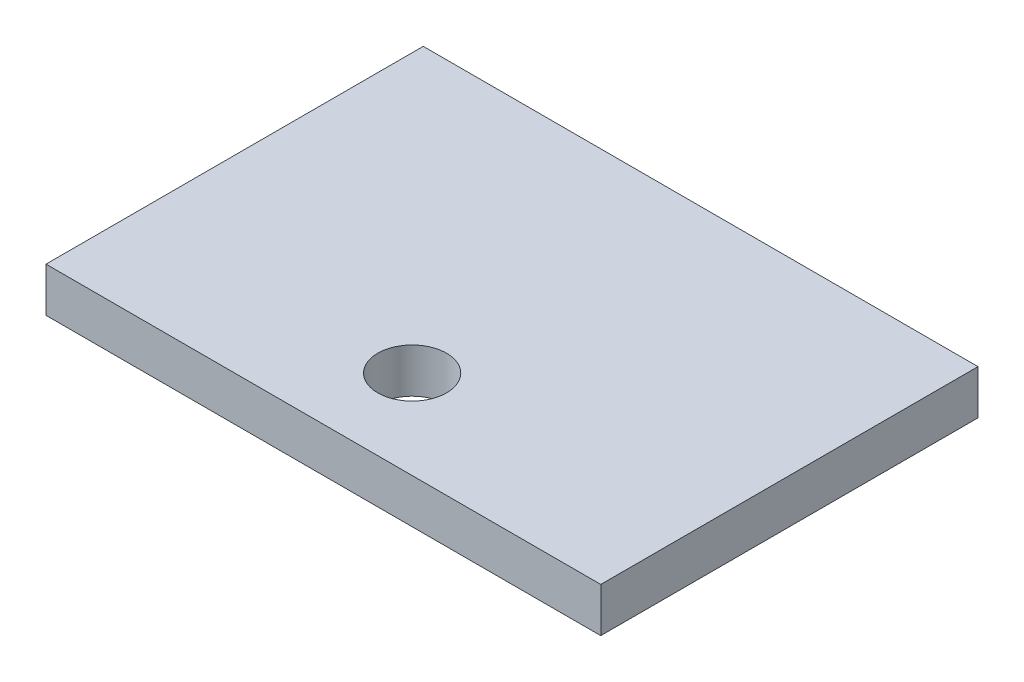
ISO-10303-21;
HEADER;
FILE_DESCRIPTION(('STEP AP214'),'2;1');
FILE_NAME('part.step','',(''),(''),'','','');
FILE_SCHEMA(('AUTOMOTIVE_DESIGN { 1 0 10303 214 1 1 1 1 }'));
ENDSEC;
DATA;
#1=APPLICATION_CONTEXT('core data for automotive mechanical design processes');
#2=APPLICATION_PROTOCOL_DEFINITION('international standard','automotive_design',2000,#1);
#3=PRODUCT_CONTEXT('',#1,'mechanical');
#4=PRODUCT('Part','Part','',(#3));
#5=PRODUCT_RELATED_PRODUCT_CATEGORY('part','',(#4));
#6=PRODUCT_DEFINITION_FORMATION('','',#4);
#7=PRODUCT_DEFINITION_CONTEXT('part definition',#1,'design');
#8=PRODUCT_DEFINITION('design','',#6,#7);
#9=PRODUCT_DEFINITION_SHAPE('','',#8);
#10=(LENGTH_UNIT() NAMED_UNIT(*) SI_UNIT(.MILLI.,.METRE.));
#11=(NAMED_UNIT(*) PLANE_ANGLE_UNIT() SI_UNIT($,.RADIAN.));
#12=(NAMED_UNIT(*) SI_UNIT($,.STERADIAN.) SOLID_ANGLE_UNIT());
#13=UNCERTAINTY_MEASURE_WITH_UNIT(LENGTH_MEASURE(1.E-05),#10,'distance_accuracy_value','');
#14=(GEOMETRIC_REPRESENTATION_CONTEXT(3) GLOBAL_UNCERTAINTY_ASSIGNED_CONTEXT((#13)) GLOBAL_UNIT_ASSIGNED_CONTEXT((#10,
#11,#12)) REPRESENTATION_CONTEXT('',''));
#15=CARTESIAN_POINT('',(0.,0.,0.));
#16=DIRECTION('',(0.,0.,1.));
#17=DIRECTION('',(1.,0.,0.));
#18=AXIS2_PLACEMENT_3D('',#15,#16,#17);
#19=CARTESIAN_POINT('',(0.,2.,0.));
#20=DIRECTION('',(0.,-1.,0.));
#21=DIRECTION('',(0.,0.,-1.));
#22=AXIS2_PLACEMENT_3D('',#19,#20,#21);
#23=PLANE('',#22);
#24=DIRECTION('',(0.,0.,-1.));
#25=VECTOR('',#24,1.);
#26=CARTESIAN_POINT('',(12.5,2.,8.5));
#27=LINE('',#26,#25);
#28=CARTESIAN_POINT('',(12.5,2.,8.5));
#29=VERTEX_POINT('',#28);
#30=CARTESIAN_POINT('',(12.5,2.,-8.5));
#31=VERTEX_POINT('',#30);
#32=EDGE_CURVE('E92',#29,#31,#27,.T.);
#33=ORIENTED_EDGE('',*,*,#32,.T.);
#34=DIRECTION('',(-1.,0.,0.));
#35=VECTOR('',#34,1.);
#36=CARTESIAN_POINT('',(-12.5,2.,-8.5));
#37=LINE('',#36,#35);
#38=CARTESIAN_POINT('',(-12.5,2.,-8.5));
#39=VERTEX_POINT('',#38);
#40=EDGE_CURVE('E87',#31,#39,#37,.T.);
#41=ORIENTED_EDGE('',*,*,#40,.T.);
#42=DIRECTION('',(0.,0.,1.));
#43=VECTOR('',#42,1.);
#44=CARTESIAN_POINT('',(-12.5,2.,8.5));
#45=LINE('',#44,#43);
#46=CARTESIAN_POINT('',(-12.5,2.,8.5));
#47=VERTEX_POINT('',#46);
#48=EDGE_CURVE('E90',#39,#47,#45,.T.);
#49=ORIENTED_EDGE('',*,*,#48,.T.);
#50=DIRECTION('',(1.,0.,0.));
#51=VECTOR('',#50,1.);
#52=CARTESIAN_POINT('',(-12.5,2.,8.5));
#53=LINE('',#52,#51);
#54=EDGE_CURVE('E57',#47,#29,#53,.T.);
#55=ORIENTED_EDGE('',*,*,#54,.T.);
#56=EDGE_LOOP('',(#33,#41,#49,#55));
#57=FACE_BOUND('',#56,.T.);
#58=CARTESIAN_POINT('',(0.,2.,4.5));
#59=DIRECTION('',(0.,1.,0.));
#60=DIRECTION('',(0.,0.,1.));
#61=AXIS2_PLACEMENT_3D('',#58,#59,#60);
#62=CIRCLE('',#61,1.55);
#63=CARTESIAN_POINT('',(0.,2.,6.05));
#64=VERTEX_POINT('',#63);
#65=EDGE_CURVE('E112',#64,#64,#62,.T.);
#66=ORIENTED_EDGE('',*,*,#65,.F.);
#67=EDGE_LOOP('',(#66));
#68=FACE_BOUND('',#67,.T.);
#69=ADVANCED_FACE('F39',(#57,#68),#23,.F.);
#70=CARTESIAN_POINT('',(0.,0.,0.));
#71=DIRECTION('',(0.,-1.,0.));
#72=DIRECTION('',(0.,0.,-1.));
#73=AXIS2_PLACEMENT_3D('',#70,#71,#72);
#74=PLANE('',#73);
#75=DIRECTION('',(0.,0.,-1.));
#76=VECTOR('',#75,1.);
#77=CARTESIAN_POINT('',(12.5,0.,8.5));
#78=LINE('',#77,#76);
#79=CARTESIAN_POINT('',(12.5,0.,8.5));
#80=VERTEX_POINT('',#79);
#81=CARTESIAN_POINT('',(12.5,0.,-8.5));
#82=VERTEX_POINT('',#81);
#83=EDGE_CURVE('E108',#80,#82,#78,.T.);
#84=ORIENTED_EDGE('',*,*,#83,.F.);
#85=DIRECTION('',(1.,0.,0.));
#86=VECTOR('',#85,1.);
#87=CARTESIAN_POINT('',(-12.5,0.,8.5));
#88=LINE('',#87,#86);
#89=CARTESIAN_POINT('',(-12.5,0.,8.5));
#90=VERTEX_POINT('',#89);
#91=EDGE_CURVE('E80',#90,#80,#88,.T.);
#92=ORIENTED_EDGE('',*,*,#91,.F.);
#93=DIRECTION('',(0.,0.,1.));
#94=VECTOR('',#93,1.);
#95=CARTESIAN_POINT('',(-12.5,0.,8.5));
#96=LINE('',#95,#94);
#97=CARTESIAN_POINT('',(-12.5,0.,-8.5));
#98=VERTEX_POINT('',#97);
#99=EDGE_CURVE('E74',#98,#90,#96,.T.);
#100=ORIENTED_EDGE('',*,*,#99,.F.);
#101=DIRECTION('',(-1.,0.,0.));
#102=VECTOR('',#101,1.);
#103=CARTESIAN_POINT('',(-12.5,0.,-8.5));
#104=LINE('',#103,#102);
#105=EDGE_CURVE('E97',#82,#98,#104,.T.);
#106=ORIENTED_EDGE('',*,*,#105,.F.);
#107=EDGE_LOOP('',(#84,#92,#100,#106));
#108=FACE_BOUND('',#107,.T.);
#109=CARTESIAN_POINT('',(0.,0.,4.5));
#110=DIRECTION('',(0.,1.,0.));
#111=DIRECTION('',(0.,0.,1.));
#112=AXIS2_PLACEMENT_3D('',#109,#110,#111);
#113=CIRCLE('',#112,1.55);
#114=CARTESIAN_POINT('',(0.,0.,6.05));
#115=VERTEX_POINT('',#114);
#116=EDGE_CURVE('E130',#115,#115,#113,.T.);
#117=ORIENTED_EDGE('',*,*,#116,.T.);
#118=EDGE_LOOP('',(#117));
#119=FACE_BOUND('',#118,.T.);
#120=ADVANCED_FACE('F125',(#108,#119),#74,.T.);
#121=CARTESIAN_POINT('',(12.5,2.,8.5));
#122=DIRECTION('',(-1.,0.,0.));
#123=DIRECTION('',(0.,0.,1.));
#124=AXIS2_PLACEMENT_3D('',#121,#122,#123);
#125=PLANE('',#124);
#126=ORIENTED_EDGE('',*,*,#83,.T.);
#127=DIRECTION('',(0.,-1.,0.));
#128=VECTOR('',#127,1.);
#129=CARTESIAN_POINT('',(12.5,2.,-8.5));
#130=LINE('',#129,#128);
#131=EDGE_CURVE('E11',#31,#82,#130,.T.);
#132=ORIENTED_EDGE('',*,*,#131,.F.);
#133=ORIENTED_EDGE('',*,*,#32,.F.);
#134=DIRECTION('',(0.,-1.,0.));
#135=VECTOR('',#134,1.);
#136=CARTESIAN_POINT('',(12.5,2.,8.5));
#137=LINE('',#136,#135);
#138=EDGE_CURVE('E104',#29,#80,#137,.T.);
#139=ORIENTED_EDGE('',*,*,#138,.T.);
#140=EDGE_LOOP('',(#126,#132,#133,#139));
#141=FACE_BOUND('',#140,.T.);
#142=ADVANCED_FACE('F41',(#141),#125,.F.);
#143=CARTESIAN_POINT('',(-12.5,2.,-8.5));
#144=DIRECTION('',(0.,0.,1.));
#145=DIRECTION('',(1.,0.,0.));
#146=AXIS2_PLACEMENT_3D('',#143,#144,#145);
#147=PLANE('',#146);
#148=ORIENTED_EDGE('',*,*,#105,.T.);
#149=DIRECTION('',(0.,-1.,0.));
#150=VECTOR('',#149,1.);
#151=CARTESIAN_POINT('',(-12.5,2.,-8.5));
#152=LINE('',#151,#150);
#153=EDGE_CURVE('E49',#39,#98,#152,.T.);
#154=ORIENTED_EDGE('',*,*,#153,.F.);
#155=ORIENTED_EDGE('',*,*,#40,.F.);
#156=ORIENTED_EDGE('',*,*,#131,.T.);
#157=EDGE_LOOP('',(#148,#154,#155,#156));
#158=FACE_BOUND('',#157,.T.);
#159=ADVANCED_FACE('F96',(#158),#147,.F.);
#160=CARTESIAN_POINT('',(-12.5,2.,8.5));
#161=DIRECTION('',(1.,0.,0.));
#162=DIRECTION('',(0.,0.,-1.));
#163=AXIS2_PLACEMENT_3D('',#160,#161,#162);
#164=PLANE('',#163);
#165=ORIENTED_EDGE('',*,*,#99,.T.);
#166=DIRECTION('',(0.,-1.,0.));
#167=VECTOR('',#166,1.);
#168=CARTESIAN_POINT('',(-12.5,2.,8.5));
#169=LINE('',#168,#167);
#170=EDGE_CURVE('E99',#47,#90,#169,.T.);
#171=ORIENTED_EDGE('',*,*,#170,.F.);
#172=ORIENTED_EDGE('',*,*,#48,.F.);
#173=ORIENTED_EDGE('',*,*,#153,.T.);
#174=EDGE_LOOP('',(#165,#171,#172,#173));
#175=FACE_BOUND('',#174,.T.);
#176=ADVANCED_FACE('F100',(#175),#164,.F.);
#177=CARTESIAN_POINT('',(-12.5,2.,8.5));
#178=DIRECTION('',(0.,0.,-1.));
#179=DIRECTION('',(-1.,0.,0.));
#180=AXIS2_PLACEMENT_3D('',#177,#178,#179);
#181=PLANE('',#180);
#182=ORIENTED_EDGE('',*,*,#91,.T.);
#183=ORIENTED_EDGE('',*,*,#138,.F.);
#184=ORIENTED_EDGE('',*,*,#54,.F.);
#185=ORIENTED_EDGE('',*,*,#170,.T.);
#186=EDGE_LOOP('',(#182,#183,#184,#185));
#187=FACE_BOUND('',#186,.T.);
#188=ADVANCED_FACE('F122',(#187),#181,.F.);
#189=CARTESIAN_POINT('',(0.,2.,4.5));
#190=DIRECTION('',(0.,-1.,0.));
#191=DIRECTION('',(0.,0.,-1.));
#192=AXIS2_PLACEMENT_3D('',#189,#190,#191);
#193=CYLINDRICAL_SURFACE('',#192,1.55);
#194=ORIENTED_EDGE('',*,*,#65,.T.);
#195=EDGE_LOOP('',(#194));
#196=FACE_BOUND('',#195,.T.);
#197=ORIENTED_EDGE('',*,*,#116,.F.);
#198=EDGE_LOOP('',(#197));
#199=FACE_BOUND('',#198,.T.);
#200=ADVANCED_FACE('F138',(#196,#199),#193,.F.);
#201=CLOSED_SHELL('',(#69,#120,#142,#159,#176,#188,#200));
#202=MANIFOLD_SOLID_BREP('B2',#201);
#203=ADVANCED_BREP_SHAPE_REPRESENTATION('',(#18,#202),#14);
#204=SHAPE_DEFINITION_REPRESENTATION(#9,#203);
ENDSEC;
END-ISO-10303-21;
